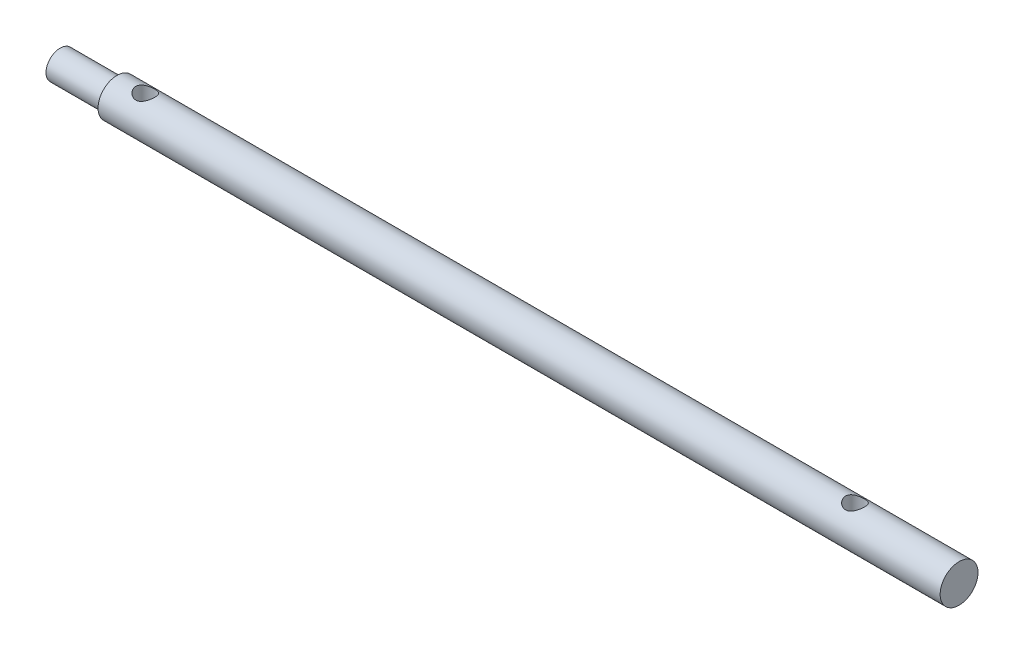
ISO-10303-21;
HEADER;
FILE_DESCRIPTION(('STEP AP214'),'2;1');
FILE_NAME('part.step','',(''),(''),'','','');
FILE_SCHEMA(('AUTOMOTIVE_DESIGN { 1 0 10303 214 1 1 1 1 }'));
ENDSEC;
DATA;
#1=APPLICATION_CONTEXT('core data for automotive mechanical design processes');
#2=APPLICATION_PROTOCOL_DEFINITION('international standard','automotive_design',2000,#1);
#3=PRODUCT_CONTEXT('',#1,'mechanical');
#4=PRODUCT('Part','Part','',(#3));
#5=PRODUCT_RELATED_PRODUCT_CATEGORY('part','',(#4));
#6=PRODUCT_DEFINITION_FORMATION('','',#4);
#7=PRODUCT_DEFINITION_CONTEXT('part definition',#1,'design');
#8=PRODUCT_DEFINITION('design','',#6,#7);
#9=PRODUCT_DEFINITION_SHAPE('','',#8);
#10=(LENGTH_UNIT() NAMED_UNIT(*) SI_UNIT(.MILLI.,.METRE.));
#11=(NAMED_UNIT(*) PLANE_ANGLE_UNIT() SI_UNIT($,.RADIAN.));
#12=(NAMED_UNIT(*) SI_UNIT($,.STERADIAN.) SOLID_ANGLE_UNIT());
#13=UNCERTAINTY_MEASURE_WITH_UNIT(LENGTH_MEASURE(1.E-05),#10,'distance_accuracy_value','');
#14=(GEOMETRIC_REPRESENTATION_CONTEXT(3) GLOBAL_UNCERTAINTY_ASSIGNED_CONTEXT((#13)) GLOBAL_UNIT_ASSIGNED_CONTEXT((#10,
#11,#12)) REPRESENTATION_CONTEXT('',''));
#15=CARTESIAN_POINT('',(0.,0.,0.));
#16=DIRECTION('',(0.,0.,1.));
#17=DIRECTION('',(1.,0.,0.));
#18=AXIS2_PLACEMENT_3D('',#15,#16,#17);
#19=CARTESIAN_POINT('',(-6.,0.,0.));
#20=DIRECTION('',(1.,0.,0.));
#21=DIRECTION('',(0.,1.,0.));
#22=AXIS2_PLACEMENT_3D('',#19,#20,#21);
#23=PLANE('',#22);
#24=CARTESIAN_POINT('',(-6.,0.,0.));
#25=DIRECTION('',(-1.,0.,0.));
#26=DIRECTION('',(0.,-1.,0.));
#27=AXIS2_PLACEMENT_3D('',#24,#25,#26);
#28=CIRCLE('',#27,1.5);
#29=CARTESIAN_POINT('',(-6.,-1.5,0.));
#30=VERTEX_POINT('',#29);
#31=EDGE_CURVE('E106',#30,#30,#28,.T.);
#32=ORIENTED_EDGE('',*,*,#31,.T.);
#33=EDGE_LOOP('',(#32));
#34=FACE_BOUND('',#33,.T.);
#35=ADVANCED_FACE('F41',(#34),#23,.F.);
#36=CARTESIAN_POINT('',(89.,0.,0.));
#37=DIRECTION('',(-1.,0.,0.));
#38=DIRECTION('',(0.,-1.,0.));
#39=AXIS2_PLACEMENT_3D('',#36,#37,#38);
#40=PLANE('',#39);
#41=CARTESIAN_POINT('',(89.,0.,0.));
#42=DIRECTION('',(-1.,0.,0.));
#43=DIRECTION('',(0.,-1.,0.));
#44=AXIS2_PLACEMENT_3D('',#41,#42,#43);
#45=CIRCLE('',#44,2.00000000000001);
#46=CARTESIAN_POINT('',(89.,-2.00000000000001,0.));
#47=VERTEX_POINT('',#46);
#48=EDGE_CURVE('E94',#47,#47,#45,.T.);
#49=ORIENTED_EDGE('',*,*,#48,.F.);
#50=EDGE_LOOP('',(#49));
#51=FACE_BOUND('',#50,.T.);
#52=ADVANCED_FACE('F123',(#51),#40,.F.);
#53=CARTESIAN_POINT('',(-6.,0.,0.));
#54=DIRECTION('',(-1.,0.,0.));
#55=DIRECTION('',(0.,-1.,0.));
#56=AXIS2_PLACEMENT_3D('',#53,#54,#55);
#57=CYLINDRICAL_SURFACE('',#56,2.00000000000001);
#58=CARTESIAN_POINT('',(4.,-2.00000000000001,0.));
#59=CARTESIAN_POINT('',(3.9999966976805,-1.99999713404152,-0.0525719629529866));
#60=CARTESIAN_POINT('',(3.99582992687833,-1.99790491019518,-0.105206599698033));
#61=CARTESIAN_POINT('',(3.97934711965908,-1.98974156037397,-0.208920235268426));
#62=CARTESIAN_POINT('',(3.96701560700235,-1.98366287828984,-0.259996086713504));
#63=CARTESIAN_POINT('',(3.93480619138321,-1.96816279403312,-0.358933544880575));
#64=CARTESIAN_POINT('',(3.91495761575199,-1.95875439177521,-0.406806802939181));
#65=CARTESIAN_POINT('',(3.86842937863506,-1.93745776515779,-0.498472616806566));
#66=CARTESIAN_POINT('',(3.84175025575115,-1.92556973633531,-0.542265493990051));
#67=CARTESIAN_POINT('',(3.7804827505147,-1.89956258258058,-0.62750781776192));
#68=CARTESIAN_POINT('',(3.74551352076036,-1.88535199127537,-0.668655211122113));
#69=CARTESIAN_POINT('',(3.66947852075297,-1.85659970246745,-0.744779444866979));
#70=CARTESIAN_POINT('',(3.62840814822756,-1.84205776209036,-0.779751583106768));
#71=CARTESIAN_POINT('',(3.53751665047662,-1.81298951197348,-0.84525200045028));
#72=CARTESIAN_POINT('',(3.48726390165409,-1.79855186970132,-0.875225335551639));
#73=CARTESIAN_POINT('',(3.38163266401379,-1.77285978772321,-0.926168226890697));
#74=CARTESIAN_POINT('',(3.32625787127725,-1.7616030760699,-0.947144214966335));
#75=CARTESIAN_POINT('',(3.21533489457808,-1.74457867037809,-0.97813244218859));
#76=CARTESIAN_POINT('',(3.15999554793261,-1.73852271583714,-0.988725857080443));
#77=CARTESIAN_POINT('',(3.04802116222052,-1.73181889948528,-1.00042699330885));
#78=CARTESIAN_POINT('',(2.99138745912884,-1.73116569343289,-1.00154408837308));
#79=CARTESIAN_POINT('',(2.88571397568463,-1.73510930257249,-0.994687287172296));
#80=CARTESIAN_POINT('',(2.83657596877695,-1.73908763662014,-0.987784559536823));
#81=CARTESIAN_POINT('',(2.74027809062696,-1.75076228733851,-0.966939849056934));
#82=CARTESIAN_POINT('',(2.69311885469468,-1.75845978831777,-0.952995623897653));
#83=CARTESIAN_POINT('',(2.60077086743434,-1.77687476412742,-0.918209780386005));
#84=CARTESIAN_POINT('',(2.55565360121421,-1.78765840663999,-0.897215067115996));
#85=CARTESIAN_POINT('',(2.46936570740999,-1.81103404281404,-0.849041687668003));
#86=CARTESIAN_POINT('',(2.42819686439991,-1.82362684780191,-0.821860243812468));
#87=CARTESIAN_POINT('',(2.34547874725677,-1.85113157903287,-0.758066054912789));
#88=CARTESIAN_POINT('',(2.30454312642384,-1.86613510236747,-0.720694458369282));
#89=CARTESIAN_POINT('',(2.2292645814091,-1.89547623300408,-0.639555578741374));
#90=CARTESIAN_POINT('',(2.19492480796612,-1.90981351958802,-0.595785256574285));
#91=CARTESIAN_POINT('',(2.13231433897027,-1.93701987282965,-0.500516505831848));
#92=CARTESIAN_POINT('',(2.10439952755426,-1.94978984162008,-0.448753591599408));
#93=CARTESIAN_POINT('',(2.05790297095699,-1.97157881121243,-0.340466215488797));
#94=CARTESIAN_POINT('',(2.03931381498483,-1.98060078943553,-0.283945576265276));
#95=CARTESIAN_POINT('',(2.01352459628332,-1.99324333741437,-0.172766491660701));
#96=CARTESIAN_POINT('',(2.00550876425322,-1.99724938301312,-0.118341530548324));
#97=CARTESIAN_POINT('',(1.99853526886551,-2.00073013459103,-0.00877959994935302));
#98=CARTESIAN_POINT('',(1.99957331436052,-2.00020698721313,0.0463570198699021));
#99=CARTESIAN_POINT('',(2.01020668841875,-1.99491192253442,0.151232971985994));
#100=CARTESIAN_POINT('',(2.01913253273003,-1.9904724568819,0.201059408049955));
#101=CARTESIAN_POINT('',(2.04423807189508,-1.9782217131482,0.298406892301918));
#102=CARTESIAN_POINT('',(2.06041856645336,-1.97041006334333,0.345927685690998));
#103=CARTESIAN_POINT('',(2.09999846643317,-1.9518425141367,0.438888608449666));
#104=CARTESIAN_POINT('',(2.12359105011681,-1.9410088176994,0.484230397006155));
#105=CARTESIAN_POINT('',(2.17710753564604,-1.9174397431711,0.570461361698922));
#106=CARTESIAN_POINT('',(2.20703413459343,-1.90470355565786,0.611348629775283));
#107=CARTESIAN_POINT('',(2.27576042533287,-1.87708221337465,0.691767689290655));
#108=CARTESIAN_POINT('',(2.31514286845356,-1.86210884848442,0.730772077824641));
#109=CARTESIAN_POINT('',(2.3999251512693,-1.83262391603875,0.801856321113242));
#110=CARTESIAN_POINT('',(2.44532911881637,-1.81811267381527,0.833931385690843));
#111=CARTESIAN_POINT('',(2.54364365420031,-1.79051192226069,0.891707914497698));
#112=CARTESIAN_POINT('',(2.5968112662086,-1.77752529663473,0.917025495878639));
#113=CARTESIAN_POINT('',(2.70751006769252,-1.75574072368127,0.958082826013805));
#114=CARTESIAN_POINT('',(2.76503552650119,-1.74693738240619,0.973834915887572));
#115=CARTESIAN_POINT('',(2.87691022286145,-1.73561501008667,0.993861687449681));
#116=CARTESIAN_POINT('',(2.93103425342904,-1.73257383460492,0.999092996400866));
#117=CARTESIAN_POINT('',(3.03944706717073,-1.73165354646176,1.00068915438079));
#118=CARTESIAN_POINT('',(3.09373576873943,-1.73377219627553,0.9970578466244));
#119=CARTESIAN_POINT('',(3.19548350153202,-1.74237862050025,0.981926125592264));
#120=CARTESIAN_POINT('',(3.2431004701444,-1.74843094482394,0.971208314342801));
#121=CARTESIAN_POINT('',(3.33580811942471,-1.76371016187918,0.943175358224646));
#122=CARTESIAN_POINT('',(3.38089798209197,-1.77293807569676,0.925858091159811));
#123=CARTESIAN_POINT('',(3.47062485098661,-1.79428530364529,0.883815745300684));
#124=CARTESIAN_POINT('',(3.5150279018297,-1.80655722396191,0.858671137816459));
#125=CARTESIAN_POINT('',(3.59927453618059,-1.83235331634591,0.802150971636635));
#126=CARTESIAN_POINT('',(3.63911573051849,-1.84587813794523,0.770772171238649));
#127=CARTESIAN_POINT('',(3.71814198235762,-1.87462323159314,0.698203326664641));
#128=CARTESIAN_POINT('',(3.75665910236192,-1.88984983311469,0.656284423010171));
#129=CARTESIAN_POINT('',(3.82626298342363,-1.91877752255088,0.56615480622028));
#130=CARTESIAN_POINT('',(3.85734573942629,-1.93247778608041,0.517940723256785));
#131=CARTESIAN_POINT('',(3.91123636276221,-1.95698009585104,0.415931596819946));
#132=CARTESIAN_POINT('',(3.93398416941144,-1.9677609656291,0.362099503934614));
#133=CARTESIAN_POINT('',(3.96980816791895,-1.98501341363466,0.25074210129419));
#134=CARTESIAN_POINT('',(3.98291184682958,-1.99149723372933,0.193227799623165));
#135=CARTESIAN_POINT('',(3.99389741107585,-1.99695461909664,0.112601946483383));
#136=CARTESIAN_POINT('',(3.99618264086362,-1.99809365339202,0.0901618794394978));
#137=CARTESIAN_POINT('',(3.99923466551681,-1.99961696977865,0.0451517318071572));
#138=CARTESIAN_POINT('',(4.0000014184712,-2.00000123103764,0.0225816476473812));
#139=CARTESIAN_POINT('',(4.,-2.00000000000001,0.));
#140=B_SPLINE_CURVE_WITH_KNOTS('',3,(#58,#59,#60,#61,#62,#63,#64,#65,#66,#67,#68,#69,#70,#71,
#72,#73,#74,#75,#76,#77,#78,#79,#80,#81,#82,#83,#84,#85,#86,#87,#88,#89,#90,#91,#92,#93,#94,#95,
#96,#97,#98,#99,#100,#101,#102,#103,#104,#105,#106,#107,#108,#109,#110,#111,#112,#113,#114,#115,
#116,#117,#118,#119,#120,#121,#122,#123,#124,#125,#126,#127,#128,#129,#130,#131,#132,#133,#134,
#135,#136,#137,#138,#139),.UNSPECIFIED.,.T.,.F.,(4,2,2,2,2,2,2,2,2,2,2,2,2,2,2,2,2,2,2,2,2,2,2,
2,2,2,2,2,2,2,2,2,2,2,2,2,2,2,2,2,4),(0.,0.157624257420293,0.315548149709198,0.472862155492299,
0.630163760581569,0.79698175871809,0.963926237654037,1.14381726430753,1.32357947898281,
1.4925801214023,1.66141357329021,1.81005712409321,1.95874803925679,2.11090240168488,
2.26312521260222,2.43464941333879,2.60625534598687,2.78583022214441,2.9652621691228,
3.12983290471346,3.29432564511476,3.44606906506122,3.59782921630932,3.75392856027899,
3.9100945074834,4.0815961064442,4.25321588615432,4.43314682159675,4.61284511940778,
4.77529307498374,4.93767059860006,5.08457930244183,5.23153528783679,5.38836456775615,
5.54527561138959,5.72125242752499,5.89732383376573,6.07464013662926,6.25144908624931,
6.31915280137698,6.38685838514848),.UNSPECIFIED.);
#141=CARTESIAN_POINT('',(4.,-2.00000000000001,0.));
#142=VERTEX_POINT('',#141);
#143=EDGE_CURVE('E10',#142,#142,#140,.T.);
#144=ORIENTED_EDGE('',*,*,#143,.T.);
#145=EDGE_LOOP('',(#144));
#146=FACE_BOUND('',#145,.T.);
#147=CARTESIAN_POINT('',(3.,1.73205080756888,1.));
#148=CARTESIAN_POINT('',(2.94789219180475,1.7320553472846,0.999996363074533));
#149=CARTESIAN_POINT('',(2.89571858847495,1.73443801187757,0.995899970733218));
#150=CARTESIAN_POINT('',(2.79297273532285,1.74362366452053,0.979723209898055));
#151=CARTESIAN_POINT('',(2.74240408495659,1.7504359405556,0.967626064554181));
#152=CARTESIAN_POINT('',(2.64454833565606,1.76749346605399,0.936099948699814));
#153=CARTESIAN_POINT('',(2.59724534752641,1.77772043473253,0.916709952493732));
#154=CARTESIAN_POINT('',(2.50657579800328,1.80042664816858,0.871267525376373));
#155=CARTESIAN_POINT('',(2.46320944973754,1.81290601476065,0.845214734035774));
#156=CARTESIAN_POINT('',(2.37769427144249,1.83996869057442,0.78466654053088));
#157=CARTESIAN_POINT('',(2.33594086432646,1.85464063637954,0.749652036143772));
#158=CARTESIAN_POINT('',(2.25859161159329,1.88371982785706,0.673253807614469));
#159=CARTESIAN_POINT('',(2.22299883741648,1.89812693831251,0.631866925782294));
#160=CARTESIAN_POINT('',(2.15663284885234,1.9262147695295,0.540489563414547));
#161=CARTESIAN_POINT('',(2.12634623214047,1.93978106418173,0.490107189012575));
#162=CARTESIAN_POINT('',(2.07485914675424,1.9635075609953,0.384157026599505));
#163=CARTESIAN_POINT('',(2.05365294386283,1.97366991183742,0.328592538138156));
#164=CARTESIAN_POINT('',(2.0224953386989,1.98880461244238,0.218044943925977));
#165=CARTESIAN_POINT('',(2.01185047364447,1.99409480220893,0.163301790488818));
#166=CARTESIAN_POINT('',(1.99983388132496,2.00007583846068,0.0525706286978482));
#167=CARTESIAN_POINT('',(1.99845654320429,2.0007694678459,-0.00341660584373854));
#168=CARTESIAN_POINT('',(2.00474667397035,1.99762981916451,-0.10983252442375));
#169=CARTESIAN_POINT('',(2.01163801552122,1.99418495892161,-0.160321199176792));
#170=CARTESIAN_POINT('',(2.03288084390466,1.98374245259748,-0.259313771918322));
#171=CARTESIAN_POINT('',(2.04723288897622,1.97674454066394,-0.307817521093926));
#172=CARTESIAN_POINT('',(2.08308256608981,1.95971583287655,-0.402309391569554));
#173=CARTESIAN_POINT('',(2.10467631317207,1.949644415292,-0.448253423515179));
#174=CARTESIAN_POINT('',(2.15426341620149,1.92737645986688,-0.53597680151333));
#175=CARTESIAN_POINT('',(2.18225906330235,1.91517916157485,-0.577754648838647));
#176=CARTESIAN_POINT('',(2.24689535153301,1.8884439439923,-0.660173660898196));
#177=CARTESIAN_POINT('',(2.28410302832601,1.87379375998176,-0.700334075029362));
#178=CARTESIAN_POINT('',(2.36458972493018,1.84454340586812,-0.774104370297782));
#179=CARTESIAN_POINT('',(2.40787337227406,1.82994328265629,-0.807709211574232));
#180=CARTESIAN_POINT('',(2.50264819242409,1.80144156092485,-0.869505334642213));
#181=CARTESIAN_POINT('',(2.55448602305421,1.78764319990708,-0.897217314978053));
#182=CARTESIAN_POINT('',(2.662937671359,1.76375450278576,-0.943319113001233));
#183=CARTESIAN_POINT('',(2.71954643301756,1.75366030046068,-0.961718658210891));
#184=CARTESIAN_POINT('',(2.83121451128279,1.73944635817035,-0.987180211025042));
#185=CARTESIAN_POINT('',(2.88604111904355,1.73491655848497,-0.995025122119977));
#186=CARTESIAN_POINT('',(2.99640134151654,1.7311791936161,-1.00151694661143));
#187=CARTESIAN_POINT('',(3.05193442911979,1.73196786889312,-1.00017035731503));
#188=CARTESIAN_POINT('',(3.15565391857873,1.73834336540586,-0.989036043343968));
#189=CARTESIAN_POINT('',(3.20397945110793,1.74339587506655,-0.980187816712468));
#190=CARTESIAN_POINT('',(3.29836778627096,1.75694021551342,-0.955696284632442));
#191=CARTESIAN_POINT('',(3.34442985074661,1.76543316005035,-0.940050778623616));
#192=CARTESIAN_POINT('',(3.4354113309027,1.78536222079657,-0.901647588604887));
#193=CARTESIAN_POINT('',(3.48017901685355,1.79691643243064,-0.878594063692724));
#194=CARTESIAN_POINT('',(3.56546927153899,1.8215611949725,-0.826287064015805));
#195=CARTESIAN_POINT('',(3.60598964351328,1.83465253355148,-0.797030404332217));
#196=CARTESIAN_POINT('',(3.68697876752355,1.86287998456337,-0.728837167198854));
#197=CARTESIAN_POINT('',(3.72679715071766,1.8780658315429,-0.689145272314967));
#198=CARTESIAN_POINT('',(3.79941223799359,1.90734234977893,-0.603404495398289));
#199=CARTESIAN_POINT('',(3.83220657023054,1.9214326500771,-0.557353474655347));
#200=CARTESIAN_POINT('',(3.8905737259501,1.94741361690958,-0.458535362558757));
#201=CARTESIAN_POINT('',(3.91593311821091,1.9592364167203,-0.405623097574113));
#202=CARTESIAN_POINT('',(3.95713790385739,1.97883354959302,-0.295522364641082));
#203=CARTESIAN_POINT('',(3.97299165136631,1.98661143676374,-0.238337701392176));
#204=CARTESIAN_POINT('',(3.99336856417466,1.99667508181883,-0.126979682330417));
#205=CARTESIAN_POINT('',(3.99879787587612,1.99939927908192,-0.0730114438504565));
#206=CARTESIAN_POINT('',(4.0008432654544,2.00042130375132,0.0351259859512042));
#207=CARTESIAN_POINT('',(3.99746242852357,1.99872068066891,0.0892951002950874));
#208=CARTESIAN_POINT('',(3.98258359320438,1.99133968837923,0.192537992317148));
#209=CARTESIAN_POINT('',(3.97163515074233,1.98592894667991,0.241712317811264));
#210=CARTESIAN_POINT('',(3.94267300069703,1.97192093663424,0.337445952183618));
#211=CARTESIAN_POINT('',(3.92465827990655,1.96332321132796,0.38400488495551));
#212=CARTESIAN_POINT('',(3.88127294783403,1.94325930748121,0.475423406244886));
#213=CARTESIAN_POINT('',(3.85562067679216,1.931686171988,0.520125142700048));
#214=CARTESIAN_POINT('',(3.79804206914095,1.90688133141827,0.604774641814026));
#215=CARTESIAN_POINT('',(3.76611285088433,1.89364886558361,0.644720207414909));
#216=CARTESIAN_POINT('',(3.6932028609773,1.86528610226628,0.722914004156893));
#217=CARTESIAN_POINT('',(3.65163751252281,1.85009799011699,0.760597684539273));
#218=CARTESIAN_POINT('',(3.56254927887023,1.82063076162853,0.828663287394676));
#219=CARTESIAN_POINT('',(3.51502117913232,1.80635245761866,0.85903875001006));
#220=CARTESIAN_POINT('',(3.41336335341905,1.77999605304917,0.912431079785656));
#221=CARTESIAN_POINT('',(3.35907246887126,1.76800174256271,0.935185065960941));
#222=CARTESIAN_POINT('',(3.24666759566022,1.74866156328352,0.970878709506413));
#223=CARTESIAN_POINT('',(3.18856711108731,1.74130016147703,0.983851191175348));
#224=CARTESIAN_POINT('',(3.108194644348,1.73529272601791,0.994367007864416));
#225=CARTESIAN_POINT('',(3.08663210560212,1.73408129005152,0.996476104963852));
#226=CARTESIAN_POINT('',(3.04338351931776,1.73245935887751,0.999293405089964));
#227=CARTESIAN_POINT('',(3.02169746361413,1.7320489172511,1.00000151439987));
#228=CARTESIAN_POINT('',(3.,1.73205080756888,1.));
#229=B_SPLINE_CURVE_WITH_KNOTS('',3,(#147,#148,#149,#150,#151,#152,#153,#154,#155,#156,#157,
#158,#159,#160,#161,#162,#163,#164,#165,#166,#167,#168,#169,#170,#171,#172,#173,#174,#175,#176,
#177,#178,#179,#180,#181,#182,#183,#184,#185,#186,#187,#188,#189,#190,#191,#192,#193,#194,#195,
#196,#197,#198,#199,#200,#201,#202,#203,#204,#205,#206,#207,#208,#209,#210,#211,#212,#213,#214,
#215,#216,#217,#218,#219,#220,#221,#222,#223,#224,#225,#226,#227,#228),.UNSPECIFIED.,.T.,.F.,(4,
2,2,2,2,2,2,2,2,2,2,2,2,2,2,2,2,2,2,2,2,2,2,2,2,2,2,2,2,2,2,2,2,2,2,2,2,2,2,2,4),(0.,
0.156232122594715,0.312792892824805,0.468528595918887,0.624272725445151,0.792862312498235,
0.961535710843711,1.14157892238764,1.32150826963891,1.48863484967935,1.6556602368604,
1.80816097484539,1.96067312517455,2.11529534731147,2.26997299350272,2.43927191456891,
2.60870048245919,2.78888841729449,2.96888774211705,3.13462290854212,3.30024093188374,
3.44774183424026,3.59529052436064,3.74967296406088,3.90413486220048,4.07806743580614,
4.25205864978203,4.43064181412966,4.60906779808772,4.77112270389488,4.93312086793972,
5.08444424871493,5.23578933512014,5.39360750719473,5.5514983010072,5.72510241850068,
5.89885942845155,6.07810749038606,6.25675133002761,6.3218013518531,6.38685572494542),.UNSPECIFIED.);
#230=CARTESIAN_POINT('',(3.,1.73205080756888,1.));
#231=VERTEX_POINT('',#230);
#232=EDGE_CURVE('E53',#231,#231,#229,.T.);
#233=ORIENTED_EDGE('',*,*,#232,.T.);
#234=EDGE_LOOP('',(#233));
#235=FACE_BOUND('',#234,.T.);
#236=CARTESIAN_POINT('',(79.,-2.00000000000001,0.));
#237=CARTESIAN_POINT('',(78.9999966976805,-1.99999713404152,-0.0525719629529859));
#238=CARTESIAN_POINT('',(78.9958299268783,-1.99790491019518,-0.105206599698031));
#239=CARTESIAN_POINT('',(78.9793471196591,-1.98974156037397,-0.208920235268424));
#240=CARTESIAN_POINT('',(78.9670156070023,-1.98366287828984,-0.259996086713502));
#241=CARTESIAN_POINT('',(78.9348061913832,-1.96816279403312,-0.358933544880573));
#242=CARTESIAN_POINT('',(78.914957615752,-1.95875439177521,-0.406806802939179));
#243=CARTESIAN_POINT('',(78.8684293786351,-1.93745776515779,-0.498472616806564));
#244=CARTESIAN_POINT('',(78.8417502557512,-1.92556973633531,-0.542265493990049));
#245=CARTESIAN_POINT('',(78.7804827505147,-1.89956258258058,-0.62750781776192));
#246=CARTESIAN_POINT('',(78.7455135207604,-1.88535199127537,-0.668655211122114));
#247=CARTESIAN_POINT('',(78.669478520753,-1.85659970246745,-0.744779444866979));
#248=CARTESIAN_POINT('',(78.6284081482275,-1.84205776209036,-0.779751583106767));
#249=CARTESIAN_POINT('',(78.5375166504766,-1.81298951197348,-0.84525200045028));
#250=CARTESIAN_POINT('',(78.4872639016541,-1.79855186970132,-0.87522533555164));
#251=CARTESIAN_POINT('',(78.3816326640138,-1.77285978772321,-0.926168226890697));
#252=CARTESIAN_POINT('',(78.3262578712772,-1.7616030760699,-0.947144214966334));
#253=CARTESIAN_POINT('',(78.2153348945781,-1.74457867037809,-0.978132442188589));
#254=CARTESIAN_POINT('',(78.1599955479326,-1.73852271583714,-0.988725857080442));
#255=CARTESIAN_POINT('',(78.0480211622205,-1.73181889948529,-1.00042699330884));
#256=CARTESIAN_POINT('',(77.9913874591288,-1.73116569343289,-1.00154408837307));
#257=CARTESIAN_POINT('',(77.8857139756846,-1.73510930257249,-0.994687287172291));
#258=CARTESIAN_POINT('',(77.836575968777,-1.73908763662015,-0.987784559536818));
#259=CARTESIAN_POINT('',(77.740278090627,-1.75076228733851,-0.966939849056931));
#260=CARTESIAN_POINT('',(77.6931188546947,-1.75845978831777,-0.952995623897652));
#261=CARTESIAN_POINT('',(77.6007708674343,-1.77687476412742,-0.918209780386004));
#262=CARTESIAN_POINT('',(77.5556536012142,-1.78765840663999,-0.897215067115992));
#263=CARTESIAN_POINT('',(77.46936570741,-1.81103404281405,-0.849041687667998));
#264=CARTESIAN_POINT('',(77.4281968643999,-1.82362684780191,-0.821860243812464));
#265=CARTESIAN_POINT('',(77.3454787472568,-1.85113157903287,-0.758066054912786));
#266=CARTESIAN_POINT('',(77.3045431264239,-1.86613510236747,-0.720694458369279));
#267=CARTESIAN_POINT('',(77.2292645814091,-1.89547623300408,-0.639555578741371));
#268=CARTESIAN_POINT('',(77.1949248079661,-1.90981351958802,-0.595785256574284));
#269=CARTESIAN_POINT('',(77.1323143389703,-1.93701987282965,-0.500516505831847));
#270=CARTESIAN_POINT('',(77.1043995275543,-1.94978984162008,-0.448753591599406));
#271=CARTESIAN_POINT('',(77.057902970957,-1.97157881121243,-0.340466215488791));
#272=CARTESIAN_POINT('',(77.0393138149848,-1.98060078943553,-0.283945576265269));
#273=CARTESIAN_POINT('',(77.0135245962833,-1.99324333741437,-0.172766491660693));
#274=CARTESIAN_POINT('',(77.0055087642532,-1.99724938301312,-0.118341530548317));
#275=CARTESIAN_POINT('',(76.9985352688655,-2.00073013459103,-0.00877959994934899));
#276=CARTESIAN_POINT('',(76.9995733143605,-2.00020698721313,0.0463570198699043));
#277=CARTESIAN_POINT('',(77.0102066884188,-1.99491192253441,0.151232971985995));
#278=CARTESIAN_POINT('',(77.01913253273,-1.9904724568819,0.201059408049956));
#279=CARTESIAN_POINT('',(77.0442380718951,-1.9782217131482,0.298406892301918));
#280=CARTESIAN_POINT('',(77.0604185664534,-1.97041006334333,0.345927685690997));
#281=CARTESIAN_POINT('',(77.0999984664332,-1.9518425141367,0.438888608449663));
#282=CARTESIAN_POINT('',(77.1235910501168,-1.9410088176994,0.484230397006149));
#283=CARTESIAN_POINT('',(77.177107535646,-1.9174397431711,0.570461361698918));
#284=CARTESIAN_POINT('',(77.2070341345934,-1.90470355565786,0.611348629775281));
#285=CARTESIAN_POINT('',(77.2757604253329,-1.87708221337465,0.691767689290653));
#286=CARTESIAN_POINT('',(77.3151428684536,-1.86210884848442,0.730772077824636));
#287=CARTESIAN_POINT('',(77.3999251512693,-1.83262391603875,0.801856321113237));
#288=CARTESIAN_POINT('',(77.4453291188164,-1.81811267381527,0.833931385690841));
#289=CARTESIAN_POINT('',(77.5436436542003,-1.79051192226069,0.891707914497696));
#290=CARTESIAN_POINT('',(77.5968112662086,-1.77752529663473,0.917025495878635));
#291=CARTESIAN_POINT('',(77.7075100676925,-1.75574072368127,0.958082826013799));
#292=CARTESIAN_POINT('',(77.7650355265012,-1.74693738240619,0.973834915887567));
#293=CARTESIAN_POINT('',(77.8769102228614,-1.73561501008668,0.993861687449676));
#294=CARTESIAN_POINT('',(77.931034253429,-1.73257383460492,0.999092996400862));
#295=CARTESIAN_POINT('',(78.0394470671707,-1.73165354646176,1.00068915438079));
#296=CARTESIAN_POINT('',(78.0937357687394,-1.73377219627554,0.997057846624396));
#297=CARTESIAN_POINT('',(78.195483501532,-1.74237862050026,0.981926125592259));
#298=CARTESIAN_POINT('',(78.2431004701444,-1.74843094482395,0.971208314342794));
#299=CARTESIAN_POINT('',(78.3358081194247,-1.76371016187919,0.943175358224637));
#300=CARTESIAN_POINT('',(78.380897982092,-1.77293807569677,0.925858091159803));
#301=CARTESIAN_POINT('',(78.4706248509866,-1.79428530364529,0.88381574530068));
#302=CARTESIAN_POINT('',(78.5150279018297,-1.80655722396191,0.858671137816458));
#303=CARTESIAN_POINT('',(78.5992745361806,-1.83235331634591,0.802150971636634));
#304=CARTESIAN_POINT('',(78.6391157305185,-1.84587813794523,0.770772171238641));
#305=CARTESIAN_POINT('',(78.7181419823576,-1.87462323159314,0.698203326664629));
#306=CARTESIAN_POINT('',(78.7566591023619,-1.8898498331147,0.656284423010161));
#307=CARTESIAN_POINT('',(78.8262629834236,-1.91877752255089,0.566154806220271));
#308=CARTESIAN_POINT('',(78.8573457394263,-1.93247778608041,0.517940723256776));
#309=CARTESIAN_POINT('',(78.9112363627622,-1.95698009585104,0.415931596819937));
#310=CARTESIAN_POINT('',(78.9339841694114,-1.9677609656291,0.362099503934605));
#311=CARTESIAN_POINT('',(78.9698081679189,-1.98501341363466,0.250742101294183));
#312=CARTESIAN_POINT('',(78.9829118468296,-1.99149723372933,0.193227799623159));
#313=CARTESIAN_POINT('',(78.9938974110758,-1.99695461909664,0.112601946483378));
#314=CARTESIAN_POINT('',(78.9961826408636,-1.99809365339202,0.0901618794394933));
#315=CARTESIAN_POINT('',(78.9992346655168,-1.99961696977866,0.0451517318071546));
#316=CARTESIAN_POINT('',(79.0000014184712,-2.00000123103764,0.0225816476473799));
#317=CARTESIAN_POINT('',(79.,-2.00000000000001,0.));
#318=B_SPLINE_CURVE_WITH_KNOTS('',3,(#236,#237,#238,#239,#240,#241,#242,#243,#244,#245,#246,
#247,#248,#249,#250,#251,#252,#253,#254,#255,#256,#257,#258,#259,#260,#261,#262,#263,#264,#265,
#266,#267,#268,#269,#270,#271,#272,#273,#274,#275,#276,#277,#278,#279,#280,#281,#282,#283,#284,
#285,#286,#287,#288,#289,#290,#291,#292,#293,#294,#295,#296,#297,#298,#299,#300,#301,#302,#303,
#304,#305,#306,#307,#308,#309,#310,#311,#312,#313,#314,#315,#316,#317),.UNSPECIFIED.,.T.,.F.,(4,
2,2,2,2,2,2,2,2,2,2,2,2,2,2,2,2,2,2,2,2,2,2,2,2,2,2,2,2,2,2,2,2,2,2,2,2,2,2,2,4),(0.,
0.157624257420291,0.315548149709198,0.472862155492298,0.630163760581564,0.796981758718092,
0.963926237654036,1.14381726430754,1.32357947898281,1.49258012140231,1.66141357329021,
1.8100571240932,1.95874803925678,2.11090240168487,2.26312521260221,2.43464941333877,
2.60625534598686,2.7858302221444,2.9652621691228,3.12983290471345,3.29432564511475,
3.44606906506121,3.59782921630931,3.75392856027897,3.91009450748338,4.08159610644418,
4.25321588615431,4.43314682159673,4.61284511940776,4.77529307498371,4.93767059860005,
5.08457930244183,5.23153528783677,5.38836456775612,5.54527561138958,5.72125242752499,
5.89732383376572,6.07464013662924,6.25144908624929,6.31915280137697,6.38685838514845),.UNSPECIFIED.);
#319=CARTESIAN_POINT('',(79.,-2.00000000000001,0.));
#320=VERTEX_POINT('',#319);
#321=EDGE_CURVE('E58',#320,#320,#318,.T.);
#322=ORIENTED_EDGE('',*,*,#321,.T.);
#323=EDGE_LOOP('',(#322));
#324=FACE_BOUND('',#323,.T.);
#325=CARTESIAN_POINT('',(78.,1.73205080756889,0.999999999999998));
#326=CARTESIAN_POINT('',(77.9478921918048,1.7320553472846,0.99999636307453));
#327=CARTESIAN_POINT('',(77.8957185884749,1.73443801187757,0.995899970733214));
#328=CARTESIAN_POINT('',(77.7929727353229,1.74362366452053,0.979723209898052));
#329=CARTESIAN_POINT('',(77.7424040849566,1.7504359405556,0.967626064554179));
#330=CARTESIAN_POINT('',(77.6445483356561,1.76749346605399,0.936099948699813));
#331=CARTESIAN_POINT('',(77.5972453475264,1.77772043473253,0.916709952493731));
#332=CARTESIAN_POINT('',(77.5065757980033,1.80042664816859,0.871267525376372));
#333=CARTESIAN_POINT('',(77.4632094497376,1.81290601476065,0.845214734035775));
#334=CARTESIAN_POINT('',(77.3776942714425,1.83996869057442,0.784666540530881));
#335=CARTESIAN_POINT('',(77.3359408643265,1.85464063637954,0.749652036143773));
#336=CARTESIAN_POINT('',(77.2585916115933,1.88371982785706,0.673253807614471));
#337=CARTESIAN_POINT('',(77.2229988374165,1.89812693831251,0.631866925782296));
#338=CARTESIAN_POINT('',(77.1566328488523,1.9262147695295,0.540489563414547));
#339=CARTESIAN_POINT('',(77.1263462321405,1.93978106418173,0.490107189012574));
#340=CARTESIAN_POINT('',(77.0748591467542,1.9635075609953,0.384157026599505));
#341=CARTESIAN_POINT('',(77.0536529438628,1.97366991183742,0.32859253813816));
#342=CARTESIAN_POINT('',(77.0224953386989,1.98880461244238,0.218044943925986));
#343=CARTESIAN_POINT('',(77.0118504736445,1.99409480220893,0.163301790488826));
#344=CARTESIAN_POINT('',(76.999833881325,2.00007583846068,0.0525706286978562));
#345=CARTESIAN_POINT('',(76.9984565432043,2.0007694678459,-0.00341660584373117));
#346=CARTESIAN_POINT('',(77.0047466739703,1.99762981916451,-0.109832524423743));
#347=CARTESIAN_POINT('',(77.0116380155212,1.99418495892161,-0.160321199176784));
#348=CARTESIAN_POINT('',(77.0328808439047,1.98374245259748,-0.259313771918315));
#349=CARTESIAN_POINT('',(77.0472328889762,1.97674454066395,-0.307817521093918));
#350=CARTESIAN_POINT('',(77.0830825660898,1.95971583287655,-0.402309391569543));
#351=CARTESIAN_POINT('',(77.104676313172,1.949644415292,-0.448253423515164));
#352=CARTESIAN_POINT('',(77.1542634162015,1.92737645986688,-0.535976801513314));
#353=CARTESIAN_POINT('',(77.1822590633024,1.91517916157485,-0.577754648838633));
#354=CARTESIAN_POINT('',(77.246895351533,1.8884439439923,-0.660173660898186));
#355=CARTESIAN_POINT('',(77.284103028326,1.87379375998176,-0.700334075029353));
#356=CARTESIAN_POINT('',(77.3645897249302,1.84454340586813,-0.774104370297774));
#357=CARTESIAN_POINT('',(77.4078733722741,1.8299432826563,-0.807709211574224));
#358=CARTESIAN_POINT('',(77.5026481924241,1.80144156092486,-0.869505334642206));
#359=CARTESIAN_POINT('',(77.5544860230542,1.78764319990709,-0.897217314978047));
#360=CARTESIAN_POINT('',(77.662937671359,1.76375450278577,-0.943319113001229));
#361=CARTESIAN_POINT('',(77.7195464330176,1.75366030046068,-0.961718658210887));
#362=CARTESIAN_POINT('',(77.8312145112828,1.73944635817035,-0.987180211025038));
#363=CARTESIAN_POINT('',(77.8860411190435,1.73491655848497,-0.995025122119973));
#364=CARTESIAN_POINT('',(77.9964013415165,1.7311791936161,-1.00151694661142));
#365=CARTESIAN_POINT('',(78.0519344291198,1.73196786889312,-1.00017035731502));
#366=CARTESIAN_POINT('',(78.1556539185787,1.73834336540586,-0.989036043343965));
#367=CARTESIAN_POINT('',(78.2039794511079,1.74339587506655,-0.980187816712466));
#368=CARTESIAN_POINT('',(78.298367786271,1.75694021551342,-0.955696284632439));
#369=CARTESIAN_POINT('',(78.3444298507466,1.76543316005035,-0.940050778623614));
#370=CARTESIAN_POINT('',(78.4354113309027,1.78536222079657,-0.901647588604886));
#371=CARTESIAN_POINT('',(78.4801790168535,1.79691643243064,-0.878594063692722));
#372=CARTESIAN_POINT('',(78.565469271539,1.82156119497251,-0.826287064015803));
#373=CARTESIAN_POINT('',(78.6059896435133,1.83465253355148,-0.797030404332217));
#374=CARTESIAN_POINT('',(78.6869787675236,1.86287998456337,-0.728837167198853));
#375=CARTESIAN_POINT('',(78.7267971507177,1.8780658315429,-0.689145272314962));
#376=CARTESIAN_POINT('',(78.7994122379936,1.90734234977893,-0.603404495398285));
#377=CARTESIAN_POINT('',(78.8322065702305,1.9214326500771,-0.557353474655348));
#378=CARTESIAN_POINT('',(78.8905737259501,1.94741361690957,-0.458535362558763));
#379=CARTESIAN_POINT('',(78.9159331182109,1.9592364167203,-0.405623097574119));
#380=CARTESIAN_POINT('',(78.9571379038574,1.97883354959302,-0.295522364641086));
#381=CARTESIAN_POINT('',(78.9729916513663,1.98661143676374,-0.238337701392179));
#382=CARTESIAN_POINT('',(78.9933685641747,1.99667508181883,-0.12697968233042));
#383=CARTESIAN_POINT('',(78.9987978758761,1.99939927908192,-0.0730114438504608));
#384=CARTESIAN_POINT('',(79.0008432654544,2.00042130375132,0.0351259859511989));
#385=CARTESIAN_POINT('',(78.9974624285236,1.99872068066891,0.0892951002950817));
#386=CARTESIAN_POINT('',(78.9825835932044,1.99133968837923,0.192537992317141));
#387=CARTESIAN_POINT('',(78.9716351507423,1.98592894667991,0.241712317811257));
#388=CARTESIAN_POINT('',(78.942673000697,1.97192093663424,0.337445952183611));
#389=CARTESIAN_POINT('',(78.9246582799066,1.96332321132796,0.384004884955503));
#390=CARTESIAN_POINT('',(78.881272947834,1.94325930748121,0.475423406244879));
#391=CARTESIAN_POINT('',(78.8556206767922,1.931686171988,0.52012514270004));
#392=CARTESIAN_POINT('',(78.7980420691409,1.90688133141827,0.604774641814021));
#393=CARTESIAN_POINT('',(78.7661128508843,1.89364886558361,0.644720207414907));
#394=CARTESIAN_POINT('',(78.6932028609773,1.86528610226628,0.722914004156888));
#395=CARTESIAN_POINT('',(78.6516375125228,1.85009799011699,0.760597684539261));
#396=CARTESIAN_POINT('',(78.5625492788702,1.82063076162854,0.828663287394663));
#397=CARTESIAN_POINT('',(78.5150211791323,1.80635245761866,0.859038750010051));
#398=CARTESIAN_POINT('',(78.4133633534191,1.77999605304917,0.912431079785649));
#399=CARTESIAN_POINT('',(78.3590724688713,1.76800174256271,0.935185065960933));
#400=CARTESIAN_POINT('',(78.2466675956602,1.74866156328353,0.970878709506406));
#401=CARTESIAN_POINT('',(78.1885671110873,1.74130016147703,0.983851191175342));
#402=CARTESIAN_POINT('',(78.108194644348,1.73529272601792,0.994367007864411));
#403=CARTESIAN_POINT('',(78.0866321056021,1.73408129005153,0.996476104963848));
#404=CARTESIAN_POINT('',(78.0433835193178,1.73245935887751,0.999293405089961));
#405=CARTESIAN_POINT('',(78.0216974636141,1.7320489172511,1.00000151439987));
#406=CARTESIAN_POINT('',(78.,1.73205080756889,0.999999999999998));
#407=B_SPLINE_CURVE_WITH_KNOTS('',3,(#325,#326,#327,#328,#329,#330,#331,#332,#333,#334,#335,
#336,#337,#338,#339,#340,#341,#342,#343,#344,#345,#346,#347,#348,#349,#350,#351,#352,#353,#354,
#355,#356,#357,#358,#359,#360,#361,#362,#363,#364,#365,#366,#367,#368,#369,#370,#371,#372,#373,
#374,#375,#376,#377,#378,#379,#380,#381,#382,#383,#384,#385,#386,#387,#388,#389,#390,#391,#392,
#393,#394,#395,#396,#397,#398,#399,#400,#401,#402,#403,#404,#405,#406),.UNSPECIFIED.,.T.,.F.,(4,
2,2,2,2,2,2,2,2,2,2,2,2,2,2,2,2,2,2,2,2,2,2,2,2,2,2,2,2,2,2,2,2,2,2,2,2,2,2,2,4),(0.,
0.15623212259471,0.312792892824797,0.468528595918875,0.62427272544514,0.792862312498224,
0.961535710843708,1.14157892238763,1.3215082696389,1.48863484967934,1.65566023686039,
1.80816097484537,1.96067312517454,2.11529534731144,2.26997299350271,2.43927191456889,
2.60870048245918,2.78888841729448,2.96888774211703,3.1346229085421,3.30024093188372,
3.44774183424025,3.59529052436061,3.74967296406086,3.90413486220046,4.07806743580613,
4.252058649782,4.43064181412964,4.6090677980877,4.77112270389485,4.9331208679397,
5.0844442487149,5.23578933512011,5.39360750719471,5.55149830100717,5.72510241850064,
5.89885942845152,6.07810749038602,6.25675133002758,6.32180135185308,6.38685572494539),.UNSPECIFIED.);
#408=CARTESIAN_POINT('',(78.,1.73205080756889,0.999999999999998));
#409=VERTEX_POINT('',#408);
#410=EDGE_CURVE('E63',#409,#409,#407,.T.);
#411=ORIENTED_EDGE('',*,*,#410,.T.);
#412=EDGE_LOOP('',(#411));
#413=FACE_BOUND('',#412,.T.);
#414=CARTESIAN_POINT('',(0.,0.,0.));
#415=DIRECTION('',(-1.,0.,0.));
#416=DIRECTION('',(0.,-1.,0.));
#417=AXIS2_PLACEMENT_3D('',#414,#415,#416);
#418=CIRCLE('',#417,2.);
#419=CARTESIAN_POINT('',(0.,-2.,0.));
#420=VERTEX_POINT('',#419);
#421=EDGE_CURVE('E98',#420,#420,#418,.T.);
#422=ORIENTED_EDGE('',*,*,#421,.F.);
#423=EDGE_LOOP('',(#422));
#424=FACE_BOUND('',#423,.T.);
#425=ORIENTED_EDGE('',*,*,#48,.T.);
#426=EDGE_LOOP('',(#425));
#427=FACE_BOUND('',#426,.T.);
#428=ADVANCED_FACE('F73',(#146,#235,#324,#413,#424,#427),#57,.T.);
#429=CARTESIAN_POINT('',(0.,1.5,0.));
#430=DIRECTION('',(1.,0.,0.));
#431=DIRECTION('',(0.,1.,0.));
#432=AXIS2_PLACEMENT_3D('',#429,#430,#431);
#433=PLANE('',#432);
#434=CARTESIAN_POINT('',(0.,0.,0.));
#435=DIRECTION('',(-1.,0.,0.));
#436=DIRECTION('',(0.,-1.,0.));
#437=AXIS2_PLACEMENT_3D('',#434,#435,#436);
#438=CIRCLE('',#437,1.5);
#439=CARTESIAN_POINT('',(0.,-1.5,0.));
#440=VERTEX_POINT('',#439);
#441=EDGE_CURVE('E102',#440,#440,#438,.T.);
#442=ORIENTED_EDGE('',*,*,#441,.F.);
#443=EDGE_LOOP('',(#442));
#444=FACE_BOUND('',#443,.T.);
#445=ORIENTED_EDGE('',*,*,#421,.T.);
#446=EDGE_LOOP('',(#445));
#447=FACE_BOUND('',#446,.T.);
#448=ADVANCED_FACE('F114',(#444,#447),#433,.F.);
#449=CARTESIAN_POINT('',(-6.,0.,0.));
#450=DIRECTION('',(-1.,0.,0.));
#451=DIRECTION('',(0.,-1.,0.));
#452=AXIS2_PLACEMENT_3D('',#449,#450,#451);
#453=CYLINDRICAL_SURFACE('',#452,1.5);
#454=ORIENTED_EDGE('',*,*,#31,.F.);
#455=EDGE_LOOP('',(#454));
#456=FACE_BOUND('',#455,.T.);
#457=ORIENTED_EDGE('',*,*,#441,.T.);
#458=EDGE_LOOP('',(#457));
#459=FACE_BOUND('',#458,.T.);
#460=ADVANCED_FACE('F85',(#456,#459),#453,.T.);
#461=CARTESIAN_POINT('',(78.,-2.00000000000001,0.));
#462=DIRECTION('',(0.,1.,0.));
#463=DIRECTION('',(0.,0.,1.));
#464=AXIS2_PLACEMENT_3D('',#461,#462,#463);
#465=CYLINDRICAL_SURFACE('',#464,0.999999999999998);
#466=ORIENTED_EDGE('',*,*,#410,.F.);
#467=EDGE_LOOP('',(#466));
#468=FACE_BOUND('',#467,.T.);
#469=ORIENTED_EDGE('',*,*,#321,.F.);
#470=EDGE_LOOP('',(#469));
#471=FACE_BOUND('',#470,.T.);
#472=ADVANCED_FACE('F79',(#468,#471),#465,.F.);
#473=CARTESIAN_POINT('',(3.,-2.00000000000001,0.));
#474=DIRECTION('',(0.,1.,0.));
#475=DIRECTION('',(0.,0.,1.));
#476=AXIS2_PLACEMENT_3D('',#473,#474,#475);
#477=CYLINDRICAL_SURFACE('',#476,1.);
#478=ORIENTED_EDGE('',*,*,#232,.F.);
#479=EDGE_LOOP('',(#478));
#480=FACE_BOUND('',#479,.T.);
#481=ORIENTED_EDGE('',*,*,#143,.F.);
#482=EDGE_LOOP('',(#481));
#483=FACE_BOUND('',#482,.T.);
#484=ADVANCED_FACE('F76',(#480,#483),#477,.F.);
#485=CLOSED_SHELL('',(#35,#52,#428,#448,#460,#472,#484));
#486=MANIFOLD_SOLID_BREP('B2',#485);
#487=ADVANCED_BREP_SHAPE_REPRESENTATION('',(#18,#486),#14);
#488=SHAPE_DEFINITION_REPRESENTATION(#9,#487);
ENDSEC;
END-ISO-10303-21;
